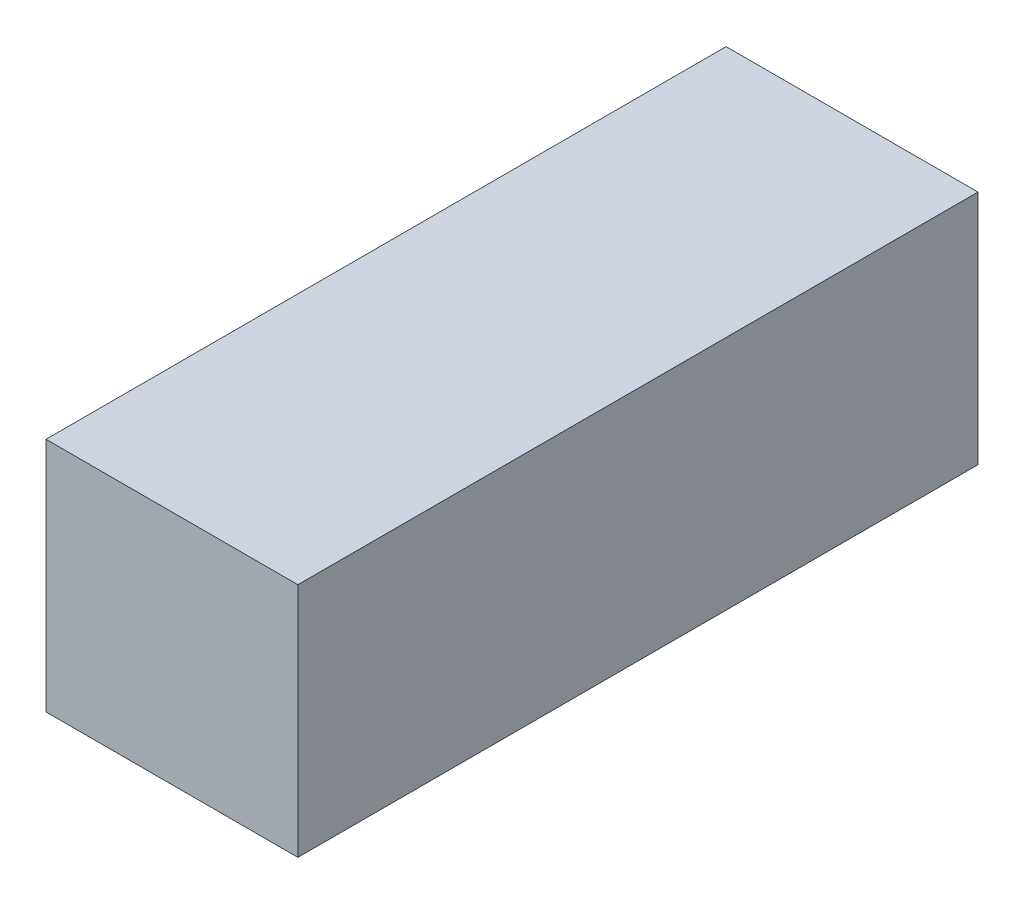
ISO-10303-21;
HEADER;
FILE_DESCRIPTION(('STEP AP214'),'2;1');
FILE_NAME('part.step','',(''),(''),'','','');
FILE_SCHEMA(('AUTOMOTIVE_DESIGN { 1 0 10303 214 1 1 1 1 }'));
ENDSEC;
DATA;
#1=APPLICATION_CONTEXT('core data for automotive mechanical design processes');
#2=APPLICATION_PROTOCOL_DEFINITION('international standard','automotive_design',2000,#1);
#3=PRODUCT_CONTEXT('',#1,'mechanical');
#4=PRODUCT('Part','Part','',(#3));
#5=PRODUCT_RELATED_PRODUCT_CATEGORY('part','',(#4));
#6=PRODUCT_DEFINITION_FORMATION('','',#4);
#7=PRODUCT_DEFINITION_CONTEXT('part definition',#1,'design');
#8=PRODUCT_DEFINITION('design','',#6,#7);
#9=PRODUCT_DEFINITION_SHAPE('','',#8);
#10=(LENGTH_UNIT() NAMED_UNIT(*) SI_UNIT(.MILLI.,.METRE.));
#11=(NAMED_UNIT(*) PLANE_ANGLE_UNIT() SI_UNIT($,.RADIAN.));
#12=(NAMED_UNIT(*) SI_UNIT($,.STERADIAN.) SOLID_ANGLE_UNIT());
#13=UNCERTAINTY_MEASURE_WITH_UNIT(LENGTH_MEASURE(1.E-05),#10,'distance_accuracy_value','');
#14=(GEOMETRIC_REPRESENTATION_CONTEXT(3) GLOBAL_UNCERTAINTY_ASSIGNED_CONTEXT((#13)) GLOBAL_UNIT_ASSIGNED_CONTEXT((#10,
#11,#12)) REPRESENTATION_CONTEXT('',''));
#15=CARTESIAN_POINT('',(0.,0.,0.));
#16=DIRECTION('',(0.,0.,1.));
#17=DIRECTION('',(1.,0.,0.));
#18=AXIS2_PLACEMENT_3D('',#15,#16,#17);
#19=CARTESIAN_POINT('',(0.,0.,72.));
#20=DIRECTION('',(-1.,0.,0.));
#21=DIRECTION('',(0.,-1.,0.));
#22=AXIS2_PLACEMENT_3D('',#19,#20,#21);
#23=PLANE('',#22);
#24=DIRECTION('',(0.,1.,0.));
#25=VECTOR('',#24,1.);
#26=CARTESIAN_POINT('',(0.,0.,0.));
#27=LINE('',#26,#25);
#28=CARTESIAN_POINT('',(0.,0.,0.));
#29=VERTEX_POINT('',#28);
#30=CARTESIAN_POINT('',(0.,25.,0.));
#31=VERTEX_POINT('',#30);
#32=EDGE_CURVE('E96',#29,#31,#27,.T.);
#33=ORIENTED_EDGE('',*,*,#32,.T.);
#34=DIRECTION('',(0.,0.,-1.));
#35=VECTOR('',#34,1.);
#36=CARTESIAN_POINT('',(0.,25.,72.));
#37=LINE('',#36,#35);
#38=CARTESIAN_POINT('',(0.,25.,72.));
#39=VERTEX_POINT('',#38);
#40=EDGE_CURVE('E11',#39,#31,#37,.T.);
#41=ORIENTED_EDGE('',*,*,#40,.F.);
#42=DIRECTION('',(0.,1.,0.));
#43=VECTOR('',#42,1.);
#44=CARTESIAN_POINT('',(0.,0.,72.));
#45=LINE('',#44,#43);
#46=CARTESIAN_POINT('',(0.,0.,72.));
#47=VERTEX_POINT('',#46);
#48=EDGE_CURVE('E84',#47,#39,#45,.T.);
#49=ORIENTED_EDGE('',*,*,#48,.F.);
#50=DIRECTION('',(0.,0.,-1.));
#51=VECTOR('',#50,1.);
#52=CARTESIAN_POINT('',(0.,0.,72.));
#53=LINE('',#52,#51);
#54=EDGE_CURVE('E92',#47,#29,#53,.T.);
#55=ORIENTED_EDGE('',*,*,#54,.T.);
#56=EDGE_LOOP('',(#33,#41,#49,#55));
#57=FACE_BOUND('',#56,.T.);
#58=ADVANCED_FACE('F33',(#57),#23,.F.);
#59=CARTESIAN_POINT('',(0.,25.,72.));
#60=DIRECTION('',(0.,-1.,0.));
#61=DIRECTION('',(1.,0.,0.));
#62=AXIS2_PLACEMENT_3D('',#59,#60,#61);
#63=PLANE('',#62);
#64=DIRECTION('',(-1.,0.,0.));
#65=VECTOR('',#64,1.);
#66=CARTESIAN_POINT('',(0.,25.,0.));
#67=LINE('',#66,#65);
#68=CARTESIAN_POINT('',(-26.666666504,25.,0.));
#69=VERTEX_POINT('',#68);
#70=EDGE_CURVE('E88',#31,#69,#67,.T.);
#71=ORIENTED_EDGE('',*,*,#70,.T.);
#72=DIRECTION('',(0.,0.,-1.));
#73=VECTOR('',#72,1.);
#74=CARTESIAN_POINT('',(-26.666666504,25.,72.));
#75=LINE('',#74,#73);
#76=CARTESIAN_POINT('',(-26.666666504,25.,72.));
#77=VERTEX_POINT('',#76);
#78=EDGE_CURVE('E41',#77,#69,#75,.T.);
#79=ORIENTED_EDGE('',*,*,#78,.F.);
#80=DIRECTION('',(-1.,0.,0.));
#81=VECTOR('',#80,1.);
#82=CARTESIAN_POINT('',(0.,25.,72.));
#83=LINE('',#82,#81);
#84=EDGE_CURVE('E79',#39,#77,#83,.T.);
#85=ORIENTED_EDGE('',*,*,#84,.F.);
#86=ORIENTED_EDGE('',*,*,#40,.T.);
#87=EDGE_LOOP('',(#71,#79,#85,#86));
#88=FACE_BOUND('',#87,.T.);
#89=ADVANCED_FACE('F87',(#88),#63,.F.);
#90=CARTESIAN_POINT('',(-26.666666504,0.,72.));
#91=DIRECTION('',(1.,0.,0.));
#92=DIRECTION('',(0.,0.,-1.));
#93=AXIS2_PLACEMENT_3D('',#90,#91,#92);
#94=PLANE('',#93);
#95=DIRECTION('',(0.,-1.,0.));
#96=VECTOR('',#95,1.);
#97=CARTESIAN_POINT('',(-26.666666504,0.,0.));
#98=LINE('',#97,#96);
#99=CARTESIAN_POINT('',(-26.666666504,0.,0.));
#100=VERTEX_POINT('',#99);
#101=EDGE_CURVE('E66',#69,#100,#98,.T.);
#102=ORIENTED_EDGE('',*,*,#101,.T.);
#103=DIRECTION('',(0.,0.,-1.));
#104=VECTOR('',#103,1.);
#105=CARTESIAN_POINT('',(-26.666666504,0.,72.));
#106=LINE('',#105,#104);
#107=CARTESIAN_POINT('',(-26.666666504,0.,72.));
#108=VERTEX_POINT('',#107);
#109=EDGE_CURVE('E89',#108,#100,#106,.T.);
#110=ORIENTED_EDGE('',*,*,#109,.F.);
#111=DIRECTION('',(0.,-1.,0.));
#112=VECTOR('',#111,1.);
#113=CARTESIAN_POINT('',(-26.666666504,0.,72.));
#114=LINE('',#113,#112);
#115=EDGE_CURVE('E82',#77,#108,#114,.T.);
#116=ORIENTED_EDGE('',*,*,#115,.F.);
#117=ORIENTED_EDGE('',*,*,#78,.T.);
#118=EDGE_LOOP('',(#102,#110,#116,#117));
#119=FACE_BOUND('',#118,.T.);
#120=ADVANCED_FACE('F90',(#119),#94,.F.);
#121=CARTESIAN_POINT('',(0.,0.,72.));
#122=DIRECTION('',(0.,1.,0.));
#123=DIRECTION('',(-1.,0.,0.));
#124=AXIS2_PLACEMENT_3D('',#121,#122,#123);
#125=PLANE('',#124);
#126=DIRECTION('',(1.,0.,0.));
#127=VECTOR('',#126,1.);
#128=CARTESIAN_POINT('',(0.,0.,0.));
#129=LINE('',#128,#127);
#130=EDGE_CURVE('E72',#100,#29,#129,.T.);
#131=ORIENTED_EDGE('',*,*,#130,.T.);
#132=ORIENTED_EDGE('',*,*,#54,.F.);
#133=DIRECTION('',(1.,0.,0.));
#134=VECTOR('',#133,1.);
#135=CARTESIAN_POINT('',(0.,0.,72.));
#136=LINE('',#135,#134);
#137=EDGE_CURVE('E49',#108,#47,#136,.T.);
#138=ORIENTED_EDGE('',*,*,#137,.F.);
#139=ORIENTED_EDGE('',*,*,#109,.T.);
#140=EDGE_LOOP('',(#131,#132,#138,#139));
#141=FACE_BOUND('',#140,.T.);
#142=ADVANCED_FACE('F103',(#141),#125,.F.);
#143=CARTESIAN_POINT('',(0.,0.,72.));
#144=DIRECTION('',(0.,0.,1.));
#145=DIRECTION('',(1.,0.,0.));
#146=AXIS2_PLACEMENT_3D('',#143,#144,#145);
#147=PLANE('',#146);
#148=ORIENTED_EDGE('',*,*,#48,.T.);
#149=ORIENTED_EDGE('',*,*,#84,.T.);
#150=ORIENTED_EDGE('',*,*,#115,.T.);
#151=ORIENTED_EDGE('',*,*,#137,.T.);
#152=EDGE_LOOP('',(#148,#149,#150,#151));
#153=FACE_BOUND('',#152,.T.);
#154=ADVANCED_FACE('F80',(#153),#147,.T.);
#155=CARTESIAN_POINT('',(0.,0.,0.));
#156=DIRECTION('',(0.,0.,1.));
#157=DIRECTION('',(1.,0.,0.));
#158=AXIS2_PLACEMENT_3D('',#155,#156,#157);
#159=PLANE('',#158);
#160=ORIENTED_EDGE('',*,*,#32,.F.);
#161=ORIENTED_EDGE('',*,*,#130,.F.);
#162=ORIENTED_EDGE('',*,*,#101,.F.);
#163=ORIENTED_EDGE('',*,*,#70,.F.);
#164=EDGE_LOOP('',(#160,#161,#162,#163));
#165=FACE_BOUND('',#164,.T.);
#166=ADVANCED_FACE('F106',(#165),#159,.F.);
#167=CLOSED_SHELL('',(#58,#89,#120,#142,#154,#166));
#168=MANIFOLD_SOLID_BREP('B2',#167);
#169=ADVANCED_BREP_SHAPE_REPRESENTATION('',(#18,#168),#14);
#170=SHAPE_DEFINITION_REPRESENTATION(#9,#169);
ENDSEC;
END-ISO-10303-21;
